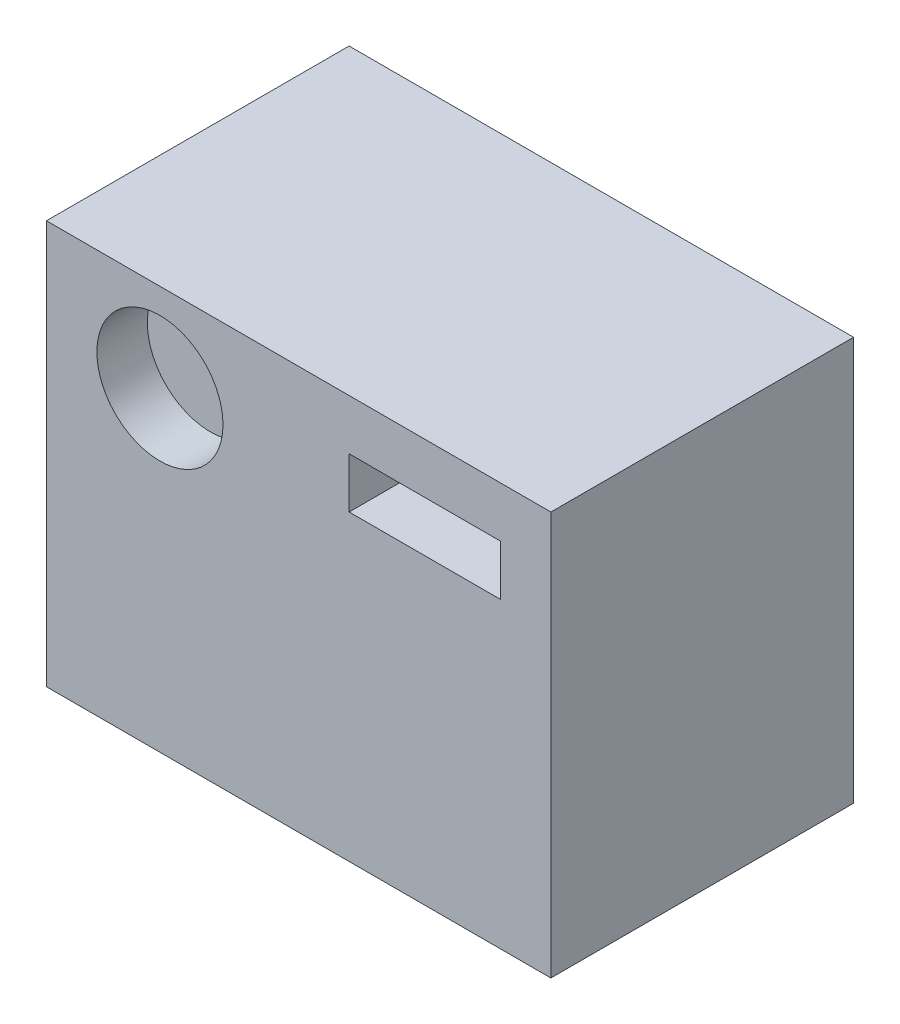
ISO-10303-21;
HEADER;
FILE_DESCRIPTION(('STEP AP214'),'2;1');
FILE_NAME('part.step','',(''),(''),'','','');
FILE_SCHEMA(('AUTOMOTIVE_DESIGN { 1 0 10303 214 1 1 1 1 }'));
ENDSEC;
DATA;
#1=APPLICATION_CONTEXT('core data for automotive mechanical design processes');
#2=APPLICATION_PROTOCOL_DEFINITION('international standard','automotive_design',2000,#1);
#3=PRODUCT_CONTEXT('',#1,'mechanical');
#4=PRODUCT('Part','Part','',(#3));
#5=PRODUCT_RELATED_PRODUCT_CATEGORY('part','',(#4));
#6=PRODUCT_DEFINITION_FORMATION('','',#4);
#7=PRODUCT_DEFINITION_CONTEXT('part definition',#1,'design');
#8=PRODUCT_DEFINITION('design','',#6,#7);
#9=PRODUCT_DEFINITION_SHAPE('','',#8);
#10=(LENGTH_UNIT() NAMED_UNIT(*) SI_UNIT(.MILLI.,.METRE.));
#11=(NAMED_UNIT(*) PLANE_ANGLE_UNIT() SI_UNIT($,.RADIAN.));
#12=(NAMED_UNIT(*) SI_UNIT($,.STERADIAN.) SOLID_ANGLE_UNIT());
#13=UNCERTAINTY_MEASURE_WITH_UNIT(LENGTH_MEASURE(1.E-05),#10,'distance_accuracy_value','');
#14=(GEOMETRIC_REPRESENTATION_CONTEXT(3) GLOBAL_UNCERTAINTY_ASSIGNED_CONTEXT((#13)) GLOBAL_UNIT_ASSIGNED_CONTEXT((#10,
#11,#12)) REPRESENTATION_CONTEXT('',''));
#15=CARTESIAN_POINT('',(0.,0.,0.));
#16=DIRECTION('',(0.,0.,1.));
#17=DIRECTION('',(1.,0.,0.));
#18=AXIS2_PLACEMENT_3D('',#15,#16,#17);
#19=CARTESIAN_POINT('',(0.,0.,12.));
#20=DIRECTION('',(1.,0.,0.));
#21=DIRECTION('',(0.,0.,-1.));
#22=AXIS2_PLACEMENT_3D('',#19,#20,#21);
#23=PLANE('',#22);
#24=DIRECTION('',(0.,-1.,0.));
#25=VECTOR('',#24,1.);
#26=CARTESIAN_POINT('',(0.,0.,0.));
#27=LINE('',#26,#25);
#28=CARTESIAN_POINT('',(0.,16.,0.));
#29=VERTEX_POINT('',#28);
#30=CARTESIAN_POINT('',(0.,0.,0.));
#31=VERTEX_POINT('',#30);
#32=EDGE_CURVE('E157',#29,#31,#27,.T.);
#33=ORIENTED_EDGE('',*,*,#32,.T.);
#34=DIRECTION('',(0.,0.,-1.));
#35=VECTOR('',#34,1.);
#36=CARTESIAN_POINT('',(0.,0.,12.));
#37=LINE('',#36,#35);
#38=CARTESIAN_POINT('',(0.,0.,12.));
#39=VERTEX_POINT('',#38);
#40=EDGE_CURVE('E11',#39,#31,#37,.T.);
#41=ORIENTED_EDGE('',*,*,#40,.F.);
#42=DIRECTION('',(0.,-1.,0.));
#43=VECTOR('',#42,1.);
#44=CARTESIAN_POINT('',(0.,0.,12.));
#45=LINE('',#44,#43);
#46=CARTESIAN_POINT('',(0.,16.,12.));
#47=VERTEX_POINT('',#46);
#48=EDGE_CURVE('E150',#47,#39,#45,.T.);
#49=ORIENTED_EDGE('',*,*,#48,.F.);
#50=DIRECTION('',(0.,0.,-1.));
#51=VECTOR('',#50,1.);
#52=CARTESIAN_POINT('',(0.,16.,12.));
#53=LINE('',#52,#51);
#54=EDGE_CURVE('E156',#47,#29,#53,.T.);
#55=ORIENTED_EDGE('',*,*,#54,.T.);
#56=EDGE_LOOP('',(#33,#41,#49,#55));
#57=FACE_BOUND('',#56,.T.);
#58=ADVANCED_FACE('F36',(#57),#23,.F.);
#59=CARTESIAN_POINT('',(0.,0.,12.));
#60=DIRECTION('',(0.,1.,0.));
#61=DIRECTION('',(0.,0.,1.));
#62=AXIS2_PLACEMENT_3D('',#59,#60,#61);
#63=PLANE('',#62);
#64=DIRECTION('',(1.,0.,0.));
#65=VECTOR('',#64,1.);
#66=CARTESIAN_POINT('',(0.,0.,0.));
#67=LINE('',#66,#65);
#68=CARTESIAN_POINT('',(20.,0.,0.));
#69=VERTEX_POINT('',#68);
#70=EDGE_CURVE('E160',#31,#69,#67,.T.);
#71=ORIENTED_EDGE('',*,*,#70,.T.);
#72=DIRECTION('',(0.,0.,-1.));
#73=VECTOR('',#72,1.);
#74=CARTESIAN_POINT('',(20.,0.,12.));
#75=LINE('',#74,#73);
#76=CARTESIAN_POINT('',(20.,0.,12.));
#77=VERTEX_POINT('',#76);
#78=EDGE_CURVE('E43',#77,#69,#75,.T.);
#79=ORIENTED_EDGE('',*,*,#78,.F.);
#80=DIRECTION('',(1.,0.,0.));
#81=VECTOR('',#80,1.);
#82=CARTESIAN_POINT('',(0.,0.,12.));
#83=LINE('',#82,#81);
#84=EDGE_CURVE('E87',#39,#77,#83,.T.);
#85=ORIENTED_EDGE('',*,*,#84,.F.);
#86=ORIENTED_EDGE('',*,*,#40,.T.);
#87=EDGE_LOOP('',(#71,#79,#85,#86));
#88=FACE_BOUND('',#87,.T.);
#89=ADVANCED_FACE('F190',(#88),#63,.F.);
#90=CARTESIAN_POINT('',(20.,0.,12.));
#91=DIRECTION('',(-1.,0.,0.));
#92=DIRECTION('',(0.,0.,1.));
#93=AXIS2_PLACEMENT_3D('',#90,#91,#92);
#94=PLANE('',#93);
#95=DIRECTION('',(0.,1.,0.));
#96=VECTOR('',#95,1.);
#97=CARTESIAN_POINT('',(20.,0.,0.));
#98=LINE('',#97,#96);
#99=CARTESIAN_POINT('',(20.,16.,0.));
#100=VERTEX_POINT('',#99);
#101=EDGE_CURVE('E163',#69,#100,#98,.T.);
#102=ORIENTED_EDGE('',*,*,#101,.T.);
#103=DIRECTION('',(0.,0.,-1.));
#104=VECTOR('',#103,1.);
#105=CARTESIAN_POINT('',(20.,16.,12.));
#106=LINE('',#105,#104);
#107=CARTESIAN_POINT('',(20.,16.,12.));
#108=VERTEX_POINT('',#107);
#109=EDGE_CURVE('E167',#108,#100,#106,.T.);
#110=ORIENTED_EDGE('',*,*,#109,.F.);
#111=DIRECTION('',(0.,1.,0.));
#112=VECTOR('',#111,1.);
#113=CARTESIAN_POINT('',(20.,0.,12.));
#114=LINE('',#113,#112);
#115=EDGE_CURVE('E153',#77,#108,#114,.T.);
#116=ORIENTED_EDGE('',*,*,#115,.F.);
#117=ORIENTED_EDGE('',*,*,#78,.T.);
#118=EDGE_LOOP('',(#102,#110,#116,#117));
#119=FACE_BOUND('',#118,.T.);
#120=ADVANCED_FACE('F172',(#119),#94,.F.);
#121=CARTESIAN_POINT('',(0.,16.,12.));
#122=DIRECTION('',(0.,-1.,0.));
#123=DIRECTION('',(0.,0.,-1.));
#124=AXIS2_PLACEMENT_3D('',#121,#122,#123);
#125=PLANE('',#124);
#126=DIRECTION('',(-1.,0.,0.));
#127=VECTOR('',#126,1.);
#128=CARTESIAN_POINT('',(0.,16.,0.));
#129=LINE('',#128,#127);
#130=EDGE_CURVE('E80',#100,#29,#129,.T.);
#131=ORIENTED_EDGE('',*,*,#130,.T.);
#132=ORIENTED_EDGE('',*,*,#54,.F.);
#133=DIRECTION('',(-1.,0.,0.));
#134=VECTOR('',#133,1.);
#135=CARTESIAN_POINT('',(0.,16.,12.));
#136=LINE('',#135,#134);
#137=EDGE_CURVE('E59',#108,#47,#136,.T.);
#138=ORIENTED_EDGE('',*,*,#137,.F.);
#139=ORIENTED_EDGE('',*,*,#109,.T.);
#140=EDGE_LOOP('',(#131,#132,#138,#139));
#141=FACE_BOUND('',#140,.T.);
#142=ADVANCED_FACE('F180',(#141),#125,.F.);
#143=CARTESIAN_POINT('',(0.,0.,12.));
#144=DIRECTION('',(0.,0.,-1.));
#145=DIRECTION('',(-1.,0.,0.));
#146=AXIS2_PLACEMENT_3D('',#143,#144,#145);
#147=PLANE('',#146);
#148=CARTESIAN_POINT('',(4.5,12.5,12.));
#149=DIRECTION('',(0.,0.,1.));
#150=DIRECTION('',(1.,0.,0.));
#151=AXIS2_PLACEMENT_3D('',#148,#149,#150);
#152=CIRCLE('',#151,2.5);
#153=CARTESIAN_POINT('',(7.,12.5,12.));
#154=VERTEX_POINT('',#153);
#155=EDGE_CURVE('E135',#154,#154,#152,.T.);
#156=ORIENTED_EDGE('',*,*,#155,.F.);
#157=EDGE_LOOP('',(#156));
#158=FACE_BOUND('',#157,.T.);
#159=DIRECTION('',(1.,0.,0.));
#160=VECTOR('',#159,1.);
#161=CARTESIAN_POINT('',(12.,12.,12.));
#162=LINE('',#161,#160);
#163=CARTESIAN_POINT('',(12.,12.,12.));
#164=VERTEX_POINT('',#163);
#165=CARTESIAN_POINT('',(18.,12.,12.));
#166=VERTEX_POINT('',#165);
#167=EDGE_CURVE('E141',#164,#166,#162,.T.);
#168=ORIENTED_EDGE('',*,*,#167,.F.);
#169=DIRECTION('',(0.,-1.,0.));
#170=VECTOR('',#169,1.);
#171=CARTESIAN_POINT('',(12.,14.,12.));
#172=LINE('',#171,#170);
#173=CARTESIAN_POINT('',(12.,14.,12.));
#174=VERTEX_POINT('',#173);
#175=EDGE_CURVE('E50',#174,#164,#172,.T.);
#176=ORIENTED_EDGE('',*,*,#175,.F.);
#177=DIRECTION('',(-1.,0.,0.));
#178=VECTOR('',#177,1.);
#179=CARTESIAN_POINT('',(12.,14.,12.));
#180=LINE('',#179,#178);
#181=CARTESIAN_POINT('',(18.,14.,12.));
#182=VERTEX_POINT('',#181);
#183=EDGE_CURVE('E129',#182,#174,#180,.T.);
#184=ORIENTED_EDGE('',*,*,#183,.F.);
#185=DIRECTION('',(0.,1.,0.));
#186=VECTOR('',#185,1.);
#187=CARTESIAN_POINT('',(18.,14.,12.));
#188=LINE('',#187,#186);
#189=EDGE_CURVE('E132',#166,#182,#188,.T.);
#190=ORIENTED_EDGE('',*,*,#189,.F.);
#191=EDGE_LOOP('',(#168,#176,#184,#190));
#192=FACE_BOUND('',#191,.T.);
#193=ORIENTED_EDGE('',*,*,#48,.T.);
#194=ORIENTED_EDGE('',*,*,#84,.T.);
#195=ORIENTED_EDGE('',*,*,#115,.T.);
#196=ORIENTED_EDGE('',*,*,#137,.T.);
#197=EDGE_LOOP('',(#193,#194,#195,#196));
#198=FACE_BOUND('',#197,.T.);
#199=ADVANCED_FACE('F182',(#158,#192,#198),#147,.F.);
#200=CARTESIAN_POINT('',(0.,0.,0.));
#201=DIRECTION('',(0.,0.,-1.));
#202=DIRECTION('',(-1.,0.,0.));
#203=AXIS2_PLACEMENT_3D('',#200,#201,#202);
#204=PLANE('',#203);
#205=ORIENTED_EDGE('',*,*,#32,.F.);
#206=ORIENTED_EDGE('',*,*,#130,.F.);
#207=ORIENTED_EDGE('',*,*,#101,.F.);
#208=ORIENTED_EDGE('',*,*,#70,.F.);
#209=EDGE_LOOP('',(#205,#206,#207,#208));
#210=FACE_BOUND('',#209,.T.);
#211=ADVANCED_FACE('F176',(#210),#204,.T.);
#212=CARTESIAN_POINT('',(12.,14.,10.));
#213=DIRECTION('',(-1.,0.,0.));
#214=DIRECTION('',(0.,0.,1.));
#215=AXIS2_PLACEMENT_3D('',#212,#213,#214);
#216=PLANE('',#215);
#217=ORIENTED_EDGE('',*,*,#175,.T.);
#218=DIRECTION('',(0.,0.,1.));
#219=VECTOR('',#218,1.);
#220=CARTESIAN_POINT('',(12.,12.,10.));
#221=LINE('',#220,#219);
#222=CARTESIAN_POINT('',(12.,12.,10.));
#223=VERTEX_POINT('',#222);
#224=EDGE_CURVE('E107',#223,#164,#221,.T.);
#225=ORIENTED_EDGE('',*,*,#224,.F.);
#226=DIRECTION('',(0.,-1.,0.));
#227=VECTOR('',#226,1.);
#228=CARTESIAN_POINT('',(12.,14.,10.));
#229=LINE('',#228,#227);
#230=CARTESIAN_POINT('',(12.,14.,10.));
#231=VERTEX_POINT('',#230);
#232=EDGE_CURVE('E111',#231,#223,#229,.T.);
#233=ORIENTED_EDGE('',*,*,#232,.F.);
#234=DIRECTION('',(0.,0.,1.));
#235=VECTOR('',#234,1.);
#236=CARTESIAN_POINT('',(12.,14.,10.));
#237=LINE('',#236,#235);
#238=EDGE_CURVE('E145',#231,#174,#237,.T.);
#239=ORIENTED_EDGE('',*,*,#238,.T.);
#240=EDGE_LOOP('',(#217,#225,#233,#239));
#241=FACE_BOUND('',#240,.T.);
#242=ADVANCED_FACE('F109',(#241),#216,.F.);
#243=CARTESIAN_POINT('',(12.,14.,10.));
#244=DIRECTION('',(0.,1.,0.));
#245=DIRECTION('',(0.,0.,1.));
#246=AXIS2_PLACEMENT_3D('',#243,#244,#245);
#247=PLANE('',#246);
#248=ORIENTED_EDGE('',*,*,#183,.T.);
#249=ORIENTED_EDGE('',*,*,#238,.F.);
#250=DIRECTION('',(-1.,0.,0.));
#251=VECTOR('',#250,1.);
#252=CARTESIAN_POINT('',(12.,14.,10.));
#253=LINE('',#252,#251);
#254=CARTESIAN_POINT('',(18.,14.,10.));
#255=VERTEX_POINT('',#254);
#256=EDGE_CURVE('E117',#255,#231,#253,.T.);
#257=ORIENTED_EDGE('',*,*,#256,.F.);
#258=DIRECTION('',(0.,0.,1.));
#259=VECTOR('',#258,1.);
#260=CARTESIAN_POINT('',(18.,14.,10.));
#261=LINE('',#260,#259);
#262=EDGE_CURVE('E147',#255,#182,#261,.T.);
#263=ORIENTED_EDGE('',*,*,#262,.T.);
#264=EDGE_LOOP('',(#248,#249,#257,#263));
#265=FACE_BOUND('',#264,.T.);
#266=ADVANCED_FACE('F229',(#265),#247,.F.);
#267=CARTESIAN_POINT('',(18.,14.,10.));
#268=DIRECTION('',(1.,0.,0.));
#269=DIRECTION('',(0.,0.,-1.));
#270=AXIS2_PLACEMENT_3D('',#267,#268,#269);
#271=PLANE('',#270);
#272=ORIENTED_EDGE('',*,*,#189,.T.);
#273=ORIENTED_EDGE('',*,*,#262,.F.);
#274=DIRECTION('',(0.,1.,0.));
#275=VECTOR('',#274,1.);
#276=CARTESIAN_POINT('',(18.,14.,10.));
#277=LINE('',#276,#275);
#278=CARTESIAN_POINT('',(18.,12.,10.));
#279=VERTEX_POINT('',#278);
#280=EDGE_CURVE('E125',#279,#255,#277,.T.);
#281=ORIENTED_EDGE('',*,*,#280,.F.);
#282=DIRECTION('',(0.,0.,1.));
#283=VECTOR('',#282,1.);
#284=CARTESIAN_POINT('',(18.,12.,10.));
#285=LINE('',#284,#283);
#286=EDGE_CURVE('E116',#279,#166,#285,.T.);
#287=ORIENTED_EDGE('',*,*,#286,.T.);
#288=EDGE_LOOP('',(#272,#273,#281,#287));
#289=FACE_BOUND('',#288,.T.);
#290=ADVANCED_FACE('F238',(#289),#271,.F.);
#291=CARTESIAN_POINT('',(12.,12.,10.));
#292=DIRECTION('',(0.,-1.,0.));
#293=DIRECTION('',(0.,0.,-1.));
#294=AXIS2_PLACEMENT_3D('',#291,#292,#293);
#295=PLANE('',#294);
#296=ORIENTED_EDGE('',*,*,#167,.T.);
#297=ORIENTED_EDGE('',*,*,#286,.F.);
#298=DIRECTION('',(1.,0.,0.));
#299=VECTOR('',#298,1.);
#300=CARTESIAN_POINT('',(12.,12.,10.));
#301=LINE('',#300,#299);
#302=EDGE_CURVE('E120',#223,#279,#301,.T.);
#303=ORIENTED_EDGE('',*,*,#302,.F.);
#304=ORIENTED_EDGE('',*,*,#224,.T.);
#305=EDGE_LOOP('',(#296,#297,#303,#304));
#306=FACE_BOUND('',#305,.T.);
#307=ADVANCED_FACE('F121',(#306),#295,.F.);
#308=CARTESIAN_POINT('',(0.,0.,10.));
#309=DIRECTION('',(0.,0.,1.));
#310=DIRECTION('',(1.,0.,0.));
#311=AXIS2_PLACEMENT_3D('',#308,#309,#310);
#312=PLANE('',#311);
#313=ORIENTED_EDGE('',*,*,#232,.T.);
#314=ORIENTED_EDGE('',*,*,#302,.T.);
#315=ORIENTED_EDGE('',*,*,#280,.T.);
#316=ORIENTED_EDGE('',*,*,#256,.T.);
#317=EDGE_LOOP('',(#313,#314,#315,#316));
#318=FACE_BOUND('',#317,.T.);
#319=ADVANCED_FACE('F127',(#318),#312,.T.);
#320=CARTESIAN_POINT('',(4.5,12.5,10.));
#321=DIRECTION('',(0.,0.,1.));
#322=DIRECTION('',(1.,0.,0.));
#323=AXIS2_PLACEMENT_3D('',#320,#321,#322);
#324=CYLINDRICAL_SURFACE('',#323,2.5);
#325=CARTESIAN_POINT('',(4.5,12.5,10.));
#326=DIRECTION('',(0.,0.,1.));
#327=DIRECTION('',(1.,0.,0.));
#328=AXIS2_PLACEMENT_3D('',#325,#326,#327);
#329=CIRCLE('',#328,2.5);
#330=CARTESIAN_POINT('',(7.,12.5,10.));
#331=VERTEX_POINT('',#330);
#332=EDGE_CURVE('E161',#331,#331,#329,.T.);
#333=ORIENTED_EDGE('',*,*,#332,.F.);
#334=EDGE_LOOP('',(#333));
#335=FACE_BOUND('',#334,.T.);
#336=ORIENTED_EDGE('',*,*,#155,.T.);
#337=EDGE_LOOP('',(#336));
#338=FACE_BOUND('',#337,.T.);
#339=ADVANCED_FACE('F265',(#335,#338),#324,.F.);
#340=CARTESIAN_POINT('',(4.5,12.5,10.));
#341=DIRECTION('',(0.,0.,1.));
#342=DIRECTION('',(1.,0.,0.));
#343=AXIS2_PLACEMENT_3D('',#340,#341,#342);
#344=PLANE('',#343);
#345=ORIENTED_EDGE('',*,*,#332,.T.);
#346=EDGE_LOOP('',(#345));
#347=FACE_BOUND('',#346,.T.);
#348=ADVANCED_FACE('F274',(#347),#344,.T.);
#349=CLOSED_SHELL('',(#58,#89,#120,#142,#199,#211,#242,#266,#290,#307,#319,#339,#348));
#350=MANIFOLD_SOLID_BREP('B2',#349);
#351=ADVANCED_BREP_SHAPE_REPRESENTATION('',(#18,#350),#14);
#352=SHAPE_DEFINITION_REPRESENTATION(#9,#351);
ENDSEC;
END-ISO-10303-21;
